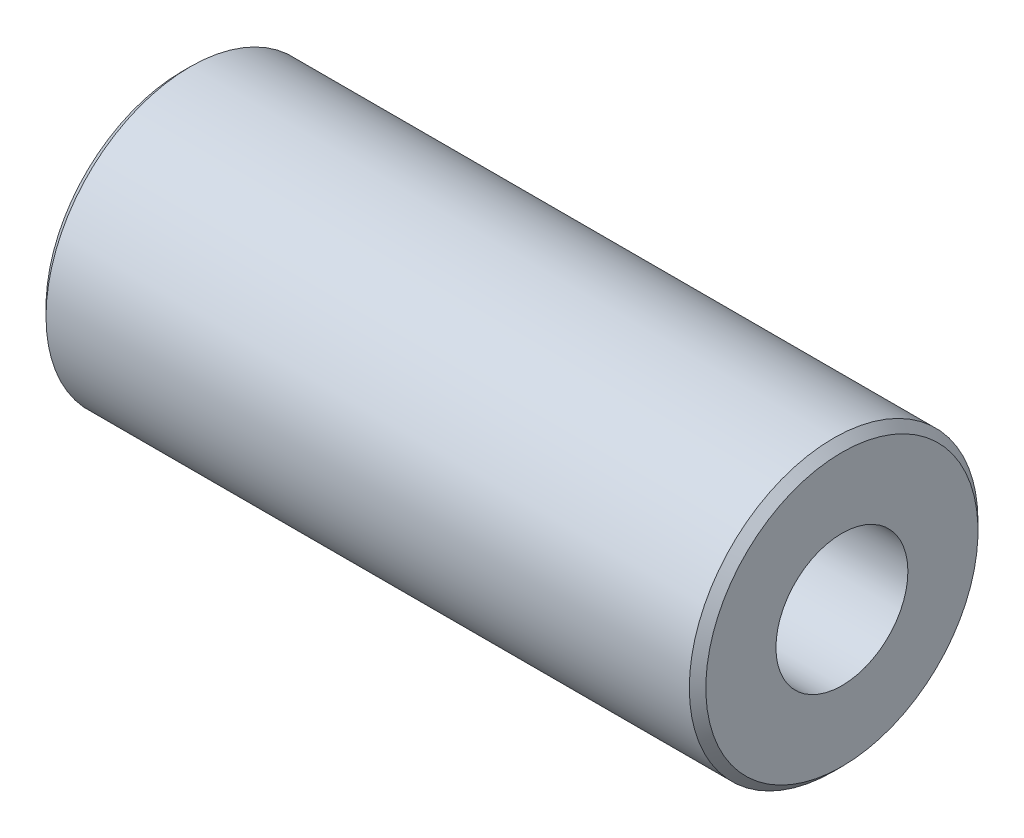
ISO-10303-21;
HEADER;
FILE_DESCRIPTION(('STEP AP214'),'2;1');
FILE_NAME('part.step','',(''),(''),'','','');
FILE_SCHEMA(('AUTOMOTIVE_DESIGN { 1 0 10303 214 1 1 1 1 }'));
ENDSEC;
DATA;
#1=APPLICATION_CONTEXT('core data for automotive mechanical design processes');
#2=APPLICATION_PROTOCOL_DEFINITION('international standard','automotive_design',2000,#1);
#3=PRODUCT_CONTEXT('',#1,'mechanical');
#4=PRODUCT('Part','Part','',(#3));
#5=PRODUCT_RELATED_PRODUCT_CATEGORY('part','',(#4));
#6=PRODUCT_DEFINITION_FORMATION('','',#4);
#7=PRODUCT_DEFINITION_CONTEXT('part definition',#1,'design');
#8=PRODUCT_DEFINITION('design','',#6,#7);
#9=PRODUCT_DEFINITION_SHAPE('','',#8);
#10=(LENGTH_UNIT() NAMED_UNIT(*) SI_UNIT(.MILLI.,.METRE.));
#11=(NAMED_UNIT(*) PLANE_ANGLE_UNIT() SI_UNIT($,.RADIAN.));
#12=(NAMED_UNIT(*) SI_UNIT($,.STERADIAN.) SOLID_ANGLE_UNIT());
#13=UNCERTAINTY_MEASURE_WITH_UNIT(LENGTH_MEASURE(1.E-05),#10,'distance_accuracy_value','');
#14=(GEOMETRIC_REPRESENTATION_CONTEXT(3) GLOBAL_UNCERTAINTY_ASSIGNED_CONTEXT((#13)) GLOBAL_UNIT_ASSIGNED_CONTEXT((#10,
#11,#12)) REPRESENTATION_CONTEXT('',''));
#15=CARTESIAN_POINT('',(0.,0.,0.));
#16=DIRECTION('',(0.,0.,1.));
#17=DIRECTION('',(1.,0.,0.));
#18=AXIS2_PLACEMENT_3D('',#15,#16,#17);
#19=CARTESIAN_POINT('',(4.,0.,0.));
#20=DIRECTION('',(-1.,0.,0.));
#21=DIRECTION('',(0.,-1.,0.));
#22=AXIS2_PLACEMENT_3D('',#19,#20,#21);
#23=PLANE('',#22);
#24=CARTESIAN_POINT('',(4.,0.,0.));
#25=DIRECTION('',(-1.,0.,0.));
#26=DIRECTION('',(0.,-1.,0.));
#27=AXIS2_PLACEMENT_3D('',#24,#25,#26);
#28=CIRCLE('',#27,1.65);
#29=CARTESIAN_POINT('',(4.,-1.65,0.));
#30=VERTEX_POINT('',#29);
#31=EDGE_CURVE('E46',#30,#30,#28,.F.);
#32=ORIENTED_EDGE('',*,*,#31,.T.);
#33=EDGE_LOOP('',(#32));
#34=FACE_BOUND('',#33,.T.);
#35=CARTESIAN_POINT('',(4.,0.,0.));
#36=DIRECTION('',(1.,0.,0.));
#37=DIRECTION('',(0.,0.,-1.));
#38=AXIS2_PLACEMENT_3D('',#35,#36,#37);
#39=CIRCLE('',#38,0.799999999999999);
#40=CARTESIAN_POINT('',(4.,0.,-0.799999999999999));
#41=VERTEX_POINT('',#40);
#42=EDGE_CURVE('E62',#41,#41,#39,.T.);
#43=ORIENTED_EDGE('',*,*,#42,.F.);
#44=EDGE_LOOP('',(#43));
#45=FACE_BOUND('',#44,.T.);
#46=ADVANCED_FACE('F38',(#34,#45),#23,.F.);
#47=CARTESIAN_POINT('',(-4.,0.,0.));
#48=DIRECTION('',(-1.,0.,0.));
#49=DIRECTION('',(0.,-1.,0.));
#50=AXIS2_PLACEMENT_3D('',#47,#48,#49);
#51=CYLINDRICAL_SURFACE('',#50,1.75);
#52=CARTESIAN_POINT('',(3.9,0.,0.));
#53=DIRECTION('',(-1.,0.,0.));
#54=DIRECTION('',(0.,-1.,0.));
#55=AXIS2_PLACEMENT_3D('',#52,#53,#54);
#56=CIRCLE('',#55,1.75);
#57=CARTESIAN_POINT('',(3.9,-1.75,0.));
#58=VERTEX_POINT('',#57);
#59=EDGE_CURVE('E50',#58,#58,#56,.T.);
#60=ORIENTED_EDGE('',*,*,#59,.T.);
#61=EDGE_LOOP('',(#60));
#62=FACE_BOUND('',#61,.T.);
#63=CARTESIAN_POINT('',(-3.9,0.,0.));
#64=DIRECTION('',(1.,0.,0.));
#65=DIRECTION('',(0.,1.,0.));
#66=AXIS2_PLACEMENT_3D('',#63,#64,#65);
#67=CIRCLE('',#66,1.75);
#68=CARTESIAN_POINT('',(-3.9,1.74999999999999,0.));
#69=VERTEX_POINT('',#68);
#70=EDGE_CURVE('E54',#69,#69,#67,.T.);
#71=ORIENTED_EDGE('',*,*,#70,.T.);
#72=EDGE_LOOP('',(#71));
#73=FACE_BOUND('',#72,.T.);
#74=ADVANCED_FACE('F69',(#62,#73),#51,.T.);
#75=CARTESIAN_POINT('',(-4.,1.74999999999999,0.));
#76=DIRECTION('',(1.,0.,0.));
#77=DIRECTION('',(0.,1.,0.));
#78=AXIS2_PLACEMENT_3D('',#75,#76,#77);
#79=PLANE('',#78);
#80=CARTESIAN_POINT('',(-4.,0.,0.));
#81=DIRECTION('',(1.,0.,0.));
#82=DIRECTION('',(0.,1.,0.));
#83=AXIS2_PLACEMENT_3D('',#80,#81,#82);
#84=CIRCLE('',#83,1.65);
#85=CARTESIAN_POINT('',(-4.,1.64999999999999,0.));
#86=VERTEX_POINT('',#85);
#87=EDGE_CURVE('E10',#86,#86,#84,.F.);
#88=ORIENTED_EDGE('',*,*,#87,.T.);
#89=EDGE_LOOP('',(#88));
#90=FACE_BOUND('',#89,.T.);
#91=CARTESIAN_POINT('',(-4.,0.,0.));
#92=DIRECTION('',(-1.,0.,0.));
#93=DIRECTION('',(0.,0.,1.));
#94=AXIS2_PLACEMENT_3D('',#91,#92,#93);
#95=CIRCLE('',#94,0.799999999999999);
#96=CARTESIAN_POINT('',(-4.,0.,0.799999999999999));
#97=VERTEX_POINT('',#96);
#98=EDGE_CURVE('E59',#97,#97,#95,.T.);
#99=ORIENTED_EDGE('',*,*,#98,.F.);
#100=EDGE_LOOP('',(#99));
#101=FACE_BOUND('',#100,.T.);
#102=ADVANCED_FACE('F74',(#90,#101),#79,.F.);
#103=CARTESIAN_POINT('',(-4.,0.,0.));
#104=DIRECTION('',(-1.,0.,0.));
#105=DIRECTION('',(0.,0.,1.));
#106=AXIS2_PLACEMENT_3D('',#103,#104,#105);
#107=CYLINDRICAL_SURFACE('',#106,0.799999999999998);
#108=ORIENTED_EDGE('',*,*,#98,.T.);
#109=EDGE_LOOP('',(#108));
#110=FACE_BOUND('',#109,.T.);
#111=ORIENTED_EDGE('',*,*,#42,.T.);
#112=EDGE_LOOP('',(#111));
#113=FACE_BOUND('',#112,.T.);
#114=ADVANCED_FACE('F66',(#110,#113),#107,.F.);
#115=CARTESIAN_POINT('',(3.9,0.,0.));
#116=DIRECTION('',(-1.,0.,0.));
#117=DIRECTION('',(0.,-1.,0.));
#118=AXIS2_PLACEMENT_3D('',#115,#116,#117);
#119=CONICAL_SURFACE('',#118,1.75,0.785398163397448);
#120=ORIENTED_EDGE('',*,*,#31,.F.);
#121=EDGE_LOOP('',(#120));
#122=FACE_BOUND('',#121,.T.);
#123=ORIENTED_EDGE('',*,*,#59,.F.);
#124=EDGE_LOOP('',(#123));
#125=FACE_BOUND('',#124,.T.);
#126=ADVANCED_FACE('F79',(#122,#125),#119,.T.);
#127=CARTESIAN_POINT('',(-4.,0.,0.));
#128=DIRECTION('',(1.,0.,0.));
#129=DIRECTION('',(0.,1.,0.));
#130=AXIS2_PLACEMENT_3D('',#127,#128,#129);
#131=CONICAL_SURFACE('',#130,1.65,0.785398163397443);
#132=ORIENTED_EDGE('',*,*,#70,.F.);
#133=EDGE_LOOP('',(#132));
#134=FACE_BOUND('',#133,.T.);
#135=ORIENTED_EDGE('',*,*,#87,.F.);
#136=EDGE_LOOP('',(#135));
#137=FACE_BOUND('',#136,.T.);
#138=ADVANCED_FACE('F41',(#134,#137),#131,.T.);
#139=CLOSED_SHELL('',(#46,#74,#102,#114,#126,#138));
#140=MANIFOLD_SOLID_BREP('B2',#139);
#141=ADVANCED_BREP_SHAPE_REPRESENTATION('',(#18,#140),#14);
#142=SHAPE_DEFINITION_REPRESENTATION(#9,#141);
ENDSEC;
END-ISO-10303-21;
